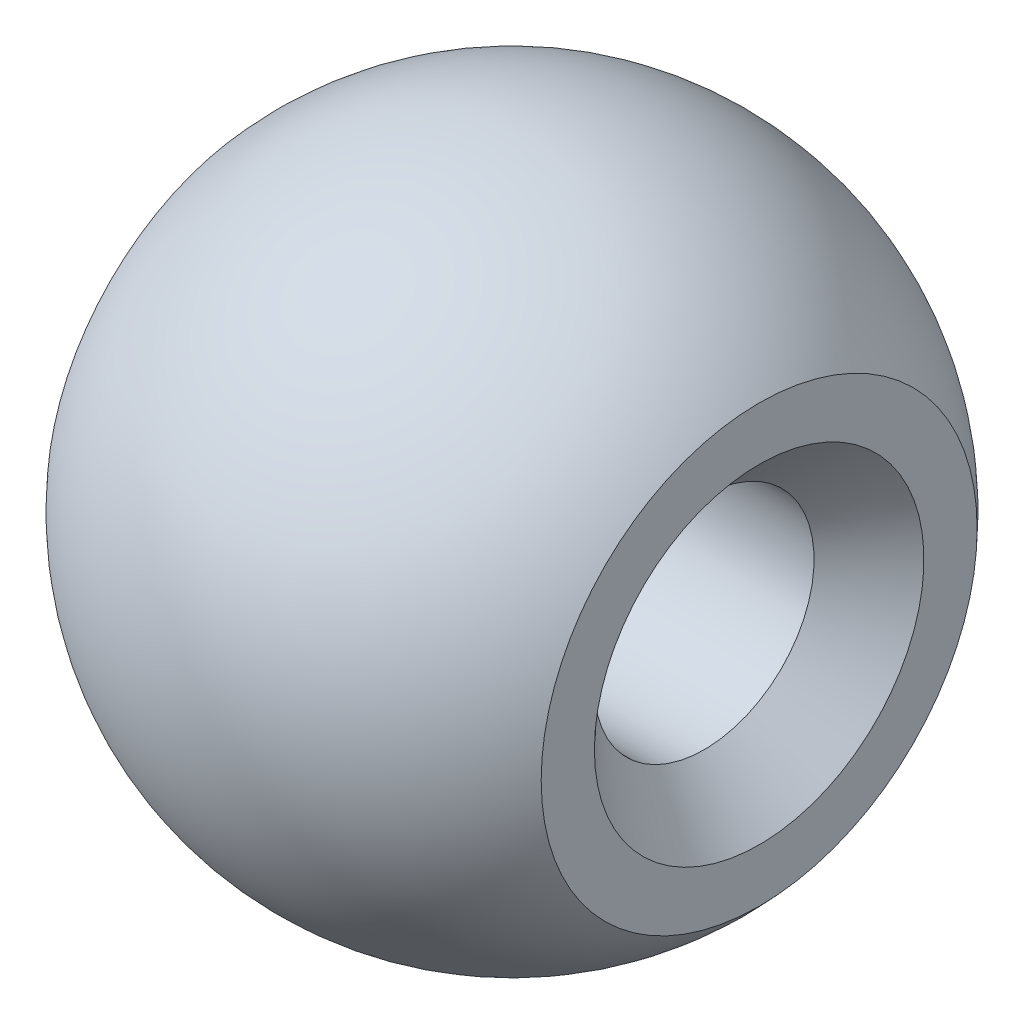
ISO-10303-21;
HEADER;
FILE_DESCRIPTION(('STEP AP214'),'2;1');
FILE_NAME('part.step','',(''),(''),'','','');
FILE_SCHEMA(('AUTOMOTIVE_DESIGN { 1 0 10303 214 1 1 1 1 }'));
ENDSEC;
DATA;
#1=APPLICATION_CONTEXT('core data for automotive mechanical design processes');
#2=APPLICATION_PROTOCOL_DEFINITION('international standard','automotive_design',2000,#1);
#3=PRODUCT_CONTEXT('',#1,'mechanical');
#4=PRODUCT('Part','Part','',(#3));
#5=PRODUCT_RELATED_PRODUCT_CATEGORY('part','',(#4));
#6=PRODUCT_DEFINITION_FORMATION('','',#4);
#7=PRODUCT_DEFINITION_CONTEXT('part definition',#1,'design');
#8=PRODUCT_DEFINITION('design','',#6,#7);
#9=PRODUCT_DEFINITION_SHAPE('','',#8);
#10=(LENGTH_UNIT() NAMED_UNIT(*) SI_UNIT(.MILLI.,.METRE.));
#11=(NAMED_UNIT(*) PLANE_ANGLE_UNIT() SI_UNIT($,.RADIAN.));
#12=(NAMED_UNIT(*) SI_UNIT($,.STERADIAN.) SOLID_ANGLE_UNIT());
#13=UNCERTAINTY_MEASURE_WITH_UNIT(LENGTH_MEASURE(1.E-05),#10,'distance_accuracy_value','');
#14=(GEOMETRIC_REPRESENTATION_CONTEXT(3) GLOBAL_UNCERTAINTY_ASSIGNED_CONTEXT((#13)) GLOBAL_UNIT_ASSIGNED_CONTEXT((#10,
#11,#12)) REPRESENTATION_CONTEXT('',''));
#15=CARTESIAN_POINT('',(0.,0.,0.));
#16=DIRECTION('',(0.,0.,1.));
#17=DIRECTION('',(1.,0.,0.));
#18=AXIS2_PLACEMENT_3D('',#15,#16,#17);
#19=CARTESIAN_POINT('',(0.,0.,0.));
#20=DIRECTION('',(-1.,0.,0.));
#21=DIRECTION('',(0.,1.,0.));
#22=AXIS2_PLACEMENT_3D('',#19,#20,#21);
#23=SPHERICAL_SURFACE('',#22,6.);
#24=CARTESIAN_POINT('',(-4.49999999999999,0.,0.));
#25=DIRECTION('',(-1.,0.,0.));
#26=DIRECTION('',(0.,0.,0.999999999999976));
#27=AXIS2_PLACEMENT_3D('',#24,#25,#26);
#28=CIRCLE('',#27,3.96862696659689);
#29=CARTESIAN_POINT('',(-4.49999999999999,3.96862696659689,0.));
#30=VERTEX_POINT('',#29);
#31=EDGE_CURVE('E10',#30,#30,#28,.T.);
#32=CARTESIAN_POINT('',(4.50000000000005,0.,0.));
#33=DIRECTION('',(-1.,0.,0.));
#34=DIRECTION('',(0.,0.,0.999999999999976));
#35=AXIS2_PLACEMENT_3D('',#32,#33,#34);
#36=CIRCLE('',#35,3.96862696659689);
#37=CARTESIAN_POINT('',(4.50000000000005,3.96862696659683,0.));
#38=VERTEX_POINT('',#37);
#39=EDGE_CURVE('E61',#38,#38,#36,.T.);
#40=CARTESIAN_POINT('',(-4.49999999999999,3.96862696659689,0.));
#41=CARTESIAN_POINT('',(-4.42988448417366,4.04813476780702,0.));
#42=CARTESIAN_POINT('',(-4.35765791170531,4.12578044526498,0.));
#43=CARTESIAN_POINT('',(-4.20919440386365,4.27713817883407,0.));
#44=CARTESIAN_POINT('',(-4.13295746849033,4.35085023494522,0.));
#45=CARTESIAN_POINT('',(-3.97668498521781,4.49413135197821,0.));
#46=CARTESIAN_POINT('',(-3.89664943731861,4.56370041290006,0.));
#47=CARTESIAN_POINT('',(-3.73300516695227,4.69850076282097,0.));
#48=CARTESIAN_POINT('',(-3.64939644448514,4.76373205182004,0.));
#49=CARTESIAN_POINT('',(-3.47884049038037,4.88967347164261,0.));
#50=CARTESIAN_POINT('',(-3.39189325874274,4.95038360246611,0.));
#51=CARTESIAN_POINT('',(-3.21490454544199,5.06711223105535,0.));
#52=CARTESIAN_POINT('',(-3.12486306377888,5.12313072882109,0.));
#53=CARTESIAN_POINT('',(-2.94193874249413,5.230318737101,0.));
#54=CARTESIAN_POINT('',(-2.84905590287249,5.28148824761518,0.));
#55=CARTESIAN_POINT('',(-2.6607097539703,5.37883456206913,0.));
#56=CARTESIAN_POINT('',(-2.56524644468974,5.42501136600892,0.));
#57=CARTESIAN_POINT('',(-2.37200748850398,5.51224256718487,0.));
#58=CARTESIAN_POINT('',(-2.27423184159878,5.55329696442105,0.));
#59=CARTESIAN_POINT('',(-2.07664283810173,5.63016804073459,0.));
#60=CARTESIAN_POINT('',(-1.97682948150987,5.66598471981196,0.));
#61=CARTESIAN_POINT('',(-1.77544540970263,5.73227975951892,0.));
#62=CARTESIAN_POINT('',(-1.67387469448724,5.76275812014852,0.));
#63=CARTESIAN_POINT('',(-1.46926119256365,5.81829091677092,0.));
#64=CARTESIAN_POINT('',(-1.36621840585544,5.84334535276371,0.));
#65=CARTESIAN_POINT('',(-1.15895018274157,5.88795992837031,0.));
#66=CARTESIAN_POINT('',(-1.0547247463359,5.90752006798411,0.));
#67=CARTESIAN_POINT('',(-0.845383967399845,5.94109111122104,0.));
#68=CARTESIAN_POINT('',(-0.74026862486945,5.95510201484416,0.));
#69=CARTESIAN_POINT('',(-0.529443276782166,5.97753523292316,0.));
#70=CARTESIAN_POINT('',(-0.423733271225277,5.98595754737904,0.));
#71=CARTESIAN_POINT('',(-0.212015510445578,5.99718993091746,0.));
#72=CARTESIAN_POINT('',(-0.106007755222768,6.,0.));
#73=CARTESIAN_POINT('',(0.106007755222853,6.,0.));
#74=CARTESIAN_POINT('',(0.212015510445663,5.99718993091746,0.));
#75=CARTESIAN_POINT('',(0.423733271225362,5.98595754737904,0.));
#76=CARTESIAN_POINT('',(0.529443276782251,5.97753523292316,0.));
#77=CARTESIAN_POINT('',(0.740268624869535,5.95510201484415,0.));
#78=CARTESIAN_POINT('',(0.845383967399929,5.94109111122103,0.));
#79=CARTESIAN_POINT('',(1.05472474633599,5.9075200679841,0.));
#80=CARTESIAN_POINT('',(1.15895018274165,5.88795992837029,0.));
#81=CARTESIAN_POINT('',(1.36621840585552,5.84334535276369,0.));
#82=CARTESIAN_POINT('',(1.46926119256373,5.8182909167709,0.));
#83=CARTESIAN_POINT('',(1.67387469448732,5.7627581201485,0.));
#84=CARTESIAN_POINT('',(1.77544540970271,5.7322797595189,0.));
#85=CARTESIAN_POINT('',(1.97682948150995,5.66598471981193,0.));
#86=CARTESIAN_POINT('',(2.07664283810181,5.63016804073456,0.));
#87=CARTESIAN_POINT('',(2.27423184159886,5.55329696442102,0.));
#88=CARTESIAN_POINT('',(2.37200748850406,5.51224256718484,0.));
#89=CARTESIAN_POINT('',(2.56524644468981,5.42501136600888,0.));
#90=CARTESIAN_POINT('',(2.66070975397037,5.3788345620691,0.));
#91=CARTESIAN_POINT('',(2.84905590287257,5.28148824761514,0.));
#92=CARTESIAN_POINT('',(2.9419387424942,5.23031873710096,0.));
#93=CARTESIAN_POINT('',(3.12486306377895,5.12313072882105,0.));
#94=CARTESIAN_POINT('',(3.21490454544206,5.0671122310553,0.));
#95=CARTESIAN_POINT('',(3.39189325874281,4.95038360246606,0.));
#96=CARTESIAN_POINT('',(3.47884049038044,4.88967347164256,0.));
#97=CARTESIAN_POINT('',(3.64939644448521,4.76373205181999,0.));
#98=CARTESIAN_POINT('',(3.73300516695234,4.69850076282092,0.));
#99=CARTESIAN_POINT('',(3.89664943731867,4.5637004129,0.));
#100=CARTESIAN_POINT('',(3.97668498521788,4.49413135197815,0.));
#101=CARTESIAN_POINT('',(4.13295746849039,4.35085023494516,0.));
#102=CARTESIAN_POINT('',(4.20919440386371,4.27713817883402,0.));
#103=CARTESIAN_POINT('',(4.35765791170537,4.12578044526491,0.));
#104=CARTESIAN_POINT('',(4.42988448417372,4.04813476780696,0.));
#105=CARTESIAN_POINT('',(4.50000000000005,3.96862696659683,0.));
#106=B_SPLINE_CURVE_WITH_KNOTS('',3,(#40,#41,#42,#43,#44,#45,#46,#47,#48,#49,#50,#51,#52,#53,
#54,#55,#56,#57,#58,#59,#60,#61,#62,#63,#64,#65,#66,#67,#68,#69,#70,#71,#72,#73,#74,#75,#76,#77,
#78,#79,#80,#81,#82,#83,#84,#85,#86,#87,#88,#89,#90,#91,#92,#93,#94,#95,#96,#97,#98,#99,#100,
#101,#102,#103,#104,#105),.UNSPECIFIED.,.F.,.F.,(4,2,2,2,2,2,2,2,2,2,2,2,2,2,2,2,2,2,2,2,2,2,2,
2,2,2,2,2,2,2,2,2,4),(0.,0.31798605350072,0.635972107001441,0.953958160502161,1.27194421400288,
1.5899302675036,1.90791632100432,2.22590237450504,2.54388842800576,2.86187448150648,
3.1798605350072,3.49784658850792,3.81583264200864,4.13381869550936,4.45180474901009,
4.76979080251081,5.08777685601153,5.40576290951224,5.72374896301296,6.04173501651369,
6.35972107001441,6.67770712351513,6.99569317701585,7.31367923051657,7.63166528401729,
7.949651337518,8.26763739101873,8.58562344451945,8.90360949802017,9.22159555152089,
9.53958160502161,9.85756765852233,10.175553712023),.UNSPECIFIED.);
#107=EDGE_CURVE('BSEAM36',#30,#38,#106,.T.);
#108=ORIENTED_EDGE('',*,*,#31,.F.);
#109=ORIENTED_EDGE('',*,*,#39,.T.);
#110=ORIENTED_EDGE('',*,*,#107,.T.);
#111=ORIENTED_EDGE('',*,*,#107,.F.);
#112=EDGE_LOOP('',(#108,#110,#109,#111));
#113=FACE_BOUND('',#112,.T.);
#114=ADVANCED_FACE('F36',(#113),#23,.T.);
#115=CARTESIAN_POINT('',(-4.49999999999996,0.,0.));
#116=DIRECTION('',(1.,0.,0.));
#117=DIRECTION('',(0.,0.,-0.999999999999976));
#118=AXIS2_PLACEMENT_3D('',#115,#116,#117);
#119=PLANE('',#118);
#120=CARTESIAN_POINT('',(-4.49999999999999,0.,0.));
#121=DIRECTION('',(-1.,0.,0.));
#122=DIRECTION('',(0.,0.,0.999999999999976));
#123=AXIS2_PLACEMENT_3D('',#120,#121,#122);
#124=CIRCLE('',#123,2.);
#125=CARTESIAN_POINT('',(-4.49999999999999,3.7470027081099E-13,2.00000000000017));
#126=VERTEX_POINT('',#125);
#127=EDGE_CURVE('E43',#126,#126,#124,.T.);
#128=ORIENTED_EDGE('',*,*,#127,.F.);
#129=EDGE_LOOP('',(#128));
#130=FACE_BOUND('',#129,.T.);
#131=ORIENTED_EDGE('',*,*,#31,.T.);
#132=EDGE_LOOP('',(#131));
#133=FACE_BOUND('',#132,.T.);
#134=ADVANCED_FACE('F80',(#130,#133),#119,.F.);
#135=CARTESIAN_POINT('',(-5.99999999999989,3.7470027081099E-13,2.22044604925031E-13));
#136=DIRECTION('',(-1.,0.,0.));
#137=DIRECTION('',(0.,0.,0.999999999999976));
#138=AXIS2_PLACEMENT_3D('',#135,#136,#137);
#139=CYLINDRICAL_SURFACE('',#138,2.);
#140=CARTESIAN_POINT('',(3.50000000000002,0.,0.));
#141=DIRECTION('',(-1.,0.,0.));
#142=DIRECTION('',(0.,0.,0.999999999999976));
#143=AXIS2_PLACEMENT_3D('',#140,#141,#142);
#144=CIRCLE('',#143,2.);
#145=CARTESIAN_POINT('',(3.50000000000002,3.7470027081099E-13,2.00000000000017));
#146=VERTEX_POINT('',#145);
#147=EDGE_CURVE('E49',#146,#146,#144,.T.);
#148=CARTESIAN_POINT('',(-4.49999999999999,3.7470027081099E-13,2.00000000000017));
#149=CARTESIAN_POINT('',(-4.41666666666666,3.7470027081099E-13,2.00000000000017));
#150=CARTESIAN_POINT('',(-4.33333333333332,3.7470027081099E-13,2.00000000000017));
#151=CARTESIAN_POINT('',(-4.16666666666666,3.7470027081099E-13,2.00000000000017));
#152=CARTESIAN_POINT('',(-4.08333333333332,3.7470027081099E-13,2.00000000000017));
#153=CARTESIAN_POINT('',(-3.91666666666665,3.7470027081099E-13,2.00000000000017));
#154=CARTESIAN_POINT('',(-3.83333333333332,3.7470027081099E-13,2.00000000000017));
#155=CARTESIAN_POINT('',(-3.66666666666665,3.7470027081099E-13,2.00000000000017));
#156=CARTESIAN_POINT('',(-3.58333333333332,3.7470027081099E-13,2.00000000000017));
#157=CARTESIAN_POINT('',(-3.41666666666665,3.7470027081099E-13,2.00000000000017));
#158=CARTESIAN_POINT('',(-3.33333333333332,3.7470027081099E-13,2.00000000000017));
#159=CARTESIAN_POINT('',(-3.16666666666665,3.7470027081099E-13,2.00000000000017));
#160=CARTESIAN_POINT('',(-3.08333333333332,3.7470027081099E-13,2.00000000000017));
#161=CARTESIAN_POINT('',(-2.91666666666665,3.7470027081099E-13,2.00000000000017));
#162=CARTESIAN_POINT('',(-2.83333333333332,3.7470027081099E-13,2.00000000000017));
#163=CARTESIAN_POINT('',(-2.66666666666665,3.7470027081099E-13,2.00000000000017));
#164=CARTESIAN_POINT('',(-2.58333333333332,3.7470027081099E-13,2.00000000000017));
#165=CARTESIAN_POINT('',(-2.41666666666665,3.7470027081099E-13,2.00000000000017));
#166=CARTESIAN_POINT('',(-2.33333333333332,3.7470027081099E-13,2.00000000000017));
#167=CARTESIAN_POINT('',(-2.16666666666665,3.7470027081099E-13,2.00000000000017));
#168=CARTESIAN_POINT('',(-2.08333333333332,3.7470027081099E-13,2.00000000000017));
#169=CARTESIAN_POINT('',(-1.91666666666665,3.7470027081099E-13,2.00000000000017));
#170=CARTESIAN_POINT('',(-1.83333333333332,3.7470027081099E-13,2.00000000000017));
#171=CARTESIAN_POINT('',(-1.66666666666665,3.7470027081099E-13,2.00000000000017));
#172=CARTESIAN_POINT('',(-1.58333333333332,3.7470027081099E-13,2.00000000000017));
#173=CARTESIAN_POINT('',(-1.41666666666665,3.7470027081099E-13,2.00000000000017));
#174=CARTESIAN_POINT('',(-1.33333333333332,3.7470027081099E-13,2.00000000000017));
#175=CARTESIAN_POINT('',(-1.16666666666665,3.7470027081099E-13,2.00000000000017));
#176=CARTESIAN_POINT('',(-1.08333333333332,3.7470027081099E-13,2.00000000000017));
#177=CARTESIAN_POINT('',(-0.916666666666651,3.7470027081099E-13,2.00000000000017));
#178=CARTESIAN_POINT('',(-0.833333333333317,3.7470027081099E-13,2.00000000000017));
#179=CARTESIAN_POINT('',(-0.66666666666665,3.7470027081099E-13,2.00000000000017));
#180=CARTESIAN_POINT('',(-0.583333333333317,3.7470027081099E-13,2.00000000000017));
#181=CARTESIAN_POINT('',(-0.41666666666665,3.7470027081099E-13,2.00000000000017));
#182=CARTESIAN_POINT('',(-0.333333333333316,3.7470027081099E-13,2.00000000000017));
#183=CARTESIAN_POINT('',(-0.16666666666665,3.7470027081099E-13,2.00000000000017));
#184=CARTESIAN_POINT('',(-0.0833333333333166,3.7470027081099E-13,2.00000000000017));
#185=CARTESIAN_POINT('',(0.0833333333333502,3.7470027081099E-13,2.00000000000017));
#186=CARTESIAN_POINT('',(0.166666666666684,3.7470027081099E-13,2.00000000000017));
#187=CARTESIAN_POINT('',(0.333333333333351,3.7470027081099E-13,2.00000000000017));
#188=CARTESIAN_POINT('',(0.416666666666684,3.7470027081099E-13,2.00000000000017));
#189=CARTESIAN_POINT('',(0.583333333333351,3.7470027081099E-13,2.00000000000017));
#190=CARTESIAN_POINT('',(0.666666666666685,3.7470027081099E-13,2.00000000000017));
#191=CARTESIAN_POINT('',(0.833333333333352,3.7470027081099E-13,2.00000000000017));
#192=CARTESIAN_POINT('',(0.916666666666685,3.7470027081099E-13,2.00000000000017));
#193=CARTESIAN_POINT('',(1.08333333333335,3.7470027081099E-13,2.00000000000017));
#194=CARTESIAN_POINT('',(1.16666666666669,3.7470027081099E-13,2.00000000000017));
#195=CARTESIAN_POINT('',(1.33333333333335,3.7470027081099E-13,2.00000000000017));
#196=CARTESIAN_POINT('',(1.41666666666669,3.7470027081099E-13,2.00000000000017));
#197=CARTESIAN_POINT('',(1.58333333333335,3.7470027081099E-13,2.00000000000017));
#198=CARTESIAN_POINT('',(1.66666666666669,3.7470027081099E-13,2.00000000000017));
#199=CARTESIAN_POINT('',(1.83333333333335,3.7470027081099E-13,2.00000000000017));
#200=CARTESIAN_POINT('',(1.91666666666669,3.7470027081099E-13,2.00000000000017));
#201=CARTESIAN_POINT('',(2.08333333333335,3.7470027081099E-13,2.00000000000017));
#202=CARTESIAN_POINT('',(2.16666666666669,3.7470027081099E-13,2.00000000000017));
#203=CARTESIAN_POINT('',(2.33333333333335,3.7470027081099E-13,2.00000000000017));
#204=CARTESIAN_POINT('',(2.41666666666669,3.7470027081099E-13,2.00000000000017));
#205=CARTESIAN_POINT('',(2.58333333333335,3.7470027081099E-13,2.00000000000017));
#206=CARTESIAN_POINT('',(2.66666666666669,3.7470027081099E-13,2.00000000000017));
#207=CARTESIAN_POINT('',(2.83333333333335,3.7470027081099E-13,2.00000000000017));
#208=CARTESIAN_POINT('',(2.91666666666669,3.7470027081099E-13,2.00000000000017));
#209=CARTESIAN_POINT('',(3.08333333333335,3.7470027081099E-13,2.00000000000017));
#210=CARTESIAN_POINT('',(3.16666666666669,3.7470027081099E-13,2.00000000000017));
#211=CARTESIAN_POINT('',(3.33333333333336,3.7470027081099E-13,2.00000000000017));
#212=CARTESIAN_POINT('',(3.41666666666669,3.7470027081099E-13,2.00000000000017));
#213=CARTESIAN_POINT('',(3.50000000000002,3.7470027081099E-13,2.00000000000017));
#214=B_SPLINE_CURVE_WITH_KNOTS('',3,(#148,#149,#150,#151,#152,#153,#154,#155,#156,#157,#158,
#159,#160,#161,#162,#163,#164,#165,#166,#167,#168,#169,#170,#171,#172,#173,#174,#175,#176,#177,
#178,#179,#180,#181,#182,#183,#184,#185,#186,#187,#188,#189,#190,#191,#192,#193,#194,#195,#196,
#197,#198,#199,#200,#201,#202,#203,#204,#205,#206,#207,#208,#209,#210,#211,#212,#213),
.UNSPECIFIED.,.F.,.F.,(4,2,2,2,2,2,2,2,2,2,2,2,2,2,2,2,2,2,2,2,2,2,2,2,2,2,2,2,2,2,2,2,4),(0.,
0.250000000000001,0.500000000000001,0.750000000000002,1.,1.25,1.5,1.75,2.,2.25,2.5,2.75,
3.00000000000001,3.25000000000001,3.50000000000001,3.75000000000001,4.00000000000001,
4.25000000000001,4.50000000000001,4.75000000000001,5.00000000000001,5.25000000000001,
5.50000000000001,5.75000000000001,6.00000000000001,6.25000000000001,6.50000000000001,
6.75000000000001,7.00000000000001,7.25000000000001,7.50000000000001,7.75000000000001,
8.00000000000001),.UNSPECIFIED.);
#215=EDGE_CURVE('BSEAM76',#126,#146,#214,.T.);
#216=ORIENTED_EDGE('',*,*,#127,.T.);
#217=ORIENTED_EDGE('',*,*,#147,.F.);
#218=ORIENTED_EDGE('',*,*,#215,.T.);
#219=ORIENTED_EDGE('',*,*,#215,.F.);
#220=EDGE_LOOP('',(#216,#218,#217,#219));
#221=FACE_BOUND('',#220,.T.);
#222=ADVANCED_FACE('F76',(#221),#139,.F.);
#223=CARTESIAN_POINT('',(3.50000000000002,0.,0.));
#224=DIRECTION('',(1.,0.,0.));
#225=DIRECTION('',(0.,0.,-0.999999999999976));
#226=AXIS2_PLACEMENT_3D('',#223,#224,#225);
#227=CONICAL_SURFACE('',#226,2.,0.785398163397454);
#228=CARTESIAN_POINT('',(4.50000000000005,0.,0.));
#229=DIRECTION('',(-1.,0.,0.));
#230=DIRECTION('',(0.,0.,0.999999999999976));
#231=AXIS2_PLACEMENT_3D('',#228,#229,#230);
#232=CIRCLE('',#231,3.00000000000001);
#233=CARTESIAN_POINT('',(4.50000000000005,0.,2.99999999999988));
#234=VERTEX_POINT('',#233);
#235=EDGE_CURVE('E55',#234,#234,#232,.T.);
#236=ORIENTED_EDGE('',*,*,#235,.F.);
#237=EDGE_LOOP('',(#236));
#238=FACE_BOUND('',#237,.T.);
#239=ORIENTED_EDGE('',*,*,#147,.T.);
#240=EDGE_LOOP('',(#239));
#241=FACE_BOUND('',#240,.T.);
#242=ADVANCED_FACE('F70',(#238,#241),#227,.F.);
#243=CARTESIAN_POINT('',(4.50000000000005,0.,0.));
#244=DIRECTION('',(1.,0.,0.));
#245=DIRECTION('',(0.,0.,-0.999999999999976));
#246=AXIS2_PLACEMENT_3D('',#243,#244,#245);
#247=PLANE('',#246);
#248=ORIENTED_EDGE('',*,*,#235,.T.);
#249=EDGE_LOOP('',(#248));
#250=FACE_BOUND('',#249,.T.);
#251=ORIENTED_EDGE('',*,*,#39,.F.);
#252=EDGE_LOOP('',(#251));
#253=FACE_BOUND('',#252,.T.);
#254=ADVANCED_FACE('F68',(#250,#253),#247,.T.);
#255=CLOSED_SHELL('',(#114,#134,#222,#242,#254));
#256=MANIFOLD_SOLID_BREP('B2',#255);
#257=ADVANCED_BREP_SHAPE_REPRESENTATION('',(#18,#256),#14);
#258=SHAPE_DEFINITION_REPRESENTATION(#9,#257);
ENDSEC;
END-ISO-10303-21;
